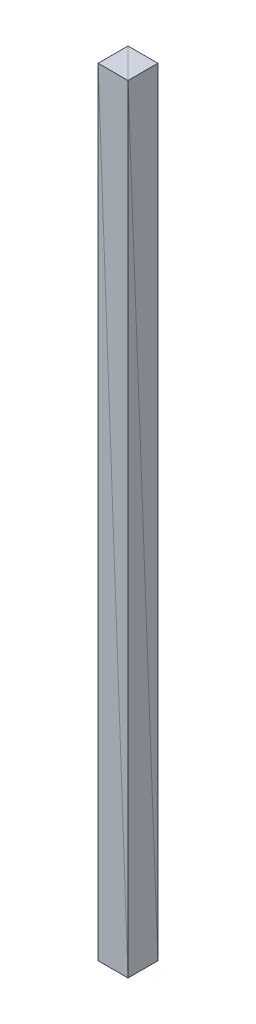
ISO-10303-21;
HEADER;
FILE_DESCRIPTION(('STEP AP214'),'2;1');
FILE_NAME('part.step','',(''),(''),'','','');
FILE_SCHEMA(('AUTOMOTIVE_DESIGN { 1 0 10303 214 1 1 1 1 }'));
ENDSEC;
DATA;
#1=APPLICATION_CONTEXT('core data for automotive mechanical design processes');
#2=APPLICATION_PROTOCOL_DEFINITION('international standard','automotive_design',2000,#1);
#3=PRODUCT_CONTEXT('',#1,'mechanical');
#4=PRODUCT('Part','Part','',(#3));
#5=PRODUCT_RELATED_PRODUCT_CATEGORY('part','',(#4));
#6=PRODUCT_DEFINITION_FORMATION('','',#4);
#7=PRODUCT_DEFINITION_CONTEXT('part definition',#1,'design');
#8=PRODUCT_DEFINITION('design','',#6,#7);
#9=PRODUCT_DEFINITION_SHAPE('','',#8);
#10=(LENGTH_UNIT() NAMED_UNIT(*) SI_UNIT(.MILLI.,.METRE.));
#11=(NAMED_UNIT(*) PLANE_ANGLE_UNIT() SI_UNIT($,.RADIAN.));
#12=(NAMED_UNIT(*) SI_UNIT($,.STERADIAN.) SOLID_ANGLE_UNIT());
#13=UNCERTAINTY_MEASURE_WITH_UNIT(LENGTH_MEASURE(1.E-05),#10,'distance_accuracy_value','');
#14=(GEOMETRIC_REPRESENTATION_CONTEXT(3) GLOBAL_UNCERTAINTY_ASSIGNED_CONTEXT((#13)) GLOBAL_UNIT_ASSIGNED_CONTEXT((#10,
#11,#12)) REPRESENTATION_CONTEXT('',''));
#15=CARTESIAN_POINT('',(0.,0.,0.));
#16=DIRECTION('',(0.,0.,1.));
#17=DIRECTION('',(1.,0.,0.));
#18=AXIS2_PLACEMENT_3D('',#15,#16,#17);
#19=CARTESIAN_POINT('',(0.,0.,0.));
#20=DIRECTION('',(0.,-1.,0.));
#21=DIRECTION('',(0.,0.,-1.));
#22=AXIS2_PLACEMENT_3D('',#19,#20,#21);
#23=PLANE('',#22);
#24=DIRECTION('',(0.,0.,1.));
#25=VECTOR('',#24,1.);
#26=CARTESIAN_POINT('',(0.,0.,0.));
#27=LINE('',#26,#25);
#28=CARTESIAN_POINT('',(0.,0.,0.));
#29=VERTEX_POINT('',#28);
#30=CARTESIAN_POINT('',(0.,0.,4.4999998062849));
#31=VERTEX_POINT('',#30);
#32=EDGE_CURVE('E19',#29,#31,#27,.T.);
#33=ORIENTED_EDGE('',*,*,#32,.F.);
#34=DIRECTION('',(-1.,0.,0.));
#35=VECTOR('',#34,1.);
#36=CARTESIAN_POINT('',(4.4999998062849,0.,0.));
#37=LINE('',#36,#35);
#38=CARTESIAN_POINT('',(4.4999998062849,0.,0.));
#39=VERTEX_POINT('',#38);
#40=EDGE_CURVE('E59',#39,#29,#37,.T.);
#41=ORIENTED_EDGE('',*,*,#40,.F.);
#42=DIRECTION('',(0.707106781186548,0.,-0.707106781186548));
#43=VECTOR('',#42,1.);
#44=CARTESIAN_POINT('',(0.,0.,4.4999998062849));
#45=LINE('',#44,#43);
#46=EDGE_CURVE('E75',#31,#39,#45,.T.);
#47=ORIENTED_EDGE('',*,*,#46,.F.);
#48=EDGE_LOOP('',(#33,#41,#47));
#49=FACE_BOUND('',#48,.T.);
#50=ADVANCED_FACE('F16',(#49),#23,.T.);
#51=CARTESIAN_POINT('',(0.,0.,0.));
#52=DIRECTION('',(1.,0.,0.));
#53=DIRECTION('',(0.,0.,-1.));
#54=AXIS2_PLACEMENT_3D('',#51,#52,#53);
#55=PLANE('',#54);
#56=ORIENTED_EDGE('',*,*,#32,.T.);
#57=DIRECTION('',(0.,-0.999261174678311,0.038433120879298));
#58=VECTOR('',#57,1.);
#59=CARTESIAN_POINT('',(0.,116.999998688698,0.));
#60=LINE('',#59,#58);
#61=CARTESIAN_POINT('',(0.,116.999998688698,0.));
#62=VERTEX_POINT('',#61);
#63=EDGE_CURVE('E86',#62,#31,#60,.T.);
#64=ORIENTED_EDGE('',*,*,#63,.F.);
#65=DIRECTION('',(0.,1.,0.));
#66=VECTOR('',#65,1.);
#67=CARTESIAN_POINT('',(0.,0.,0.));
#68=LINE('',#67,#66);
#69=EDGE_CURVE('E72',#29,#62,#68,.T.);
#70=ORIENTED_EDGE('',*,*,#69,.F.);
#71=EDGE_LOOP('',(#56,#64,#70));
#72=FACE_BOUND('',#71,.T.);
#73=ADVANCED_FACE('F149',(#72),#55,.F.);
#74=CARTESIAN_POINT('',(0.,0.,0.));
#75=DIRECTION('',(0.,0.,1.));
#76=DIRECTION('',(1.,0.,0.));
#77=AXIS2_PLACEMENT_3D('',#74,#75,#76);
#78=PLANE('',#77);
#79=ORIENTED_EDGE('',*,*,#40,.T.);
#80=DIRECTION('',(-0.038433120879298,-0.999261174678311,0.));
#81=VECTOR('',#80,1.);
#82=CARTESIAN_POINT('',(4.4999998062849,116.999998688698,0.));
#83=LINE('',#82,#81);
#84=CARTESIAN_POINT('',(4.4999998062849,116.999998688698,0.));
#85=VERTEX_POINT('',#84);
#86=EDGE_CURVE('E58',#85,#29,#83,.T.);
#87=ORIENTED_EDGE('',*,*,#86,.F.);
#88=DIRECTION('',(0.,1.,0.));
#89=VECTOR('',#88,1.);
#90=CARTESIAN_POINT('',(4.4999998062849,0.,0.));
#91=LINE('',#90,#89);
#92=EDGE_CURVE('E54',#39,#85,#91,.T.);
#93=ORIENTED_EDGE('',*,*,#92,.F.);
#94=EDGE_LOOP('',(#79,#87,#93));
#95=FACE_BOUND('',#94,.T.);
#96=ADVANCED_FACE('F60',(#95),#78,.F.);
#97=CARTESIAN_POINT('',(0.,0.,0.));
#98=DIRECTION('',(0.,0.,-1.));
#99=DIRECTION('',(-1.,0.,0.));
#100=AXIS2_PLACEMENT_3D('',#97,#98,#99);
#101=PLANE('',#100);
#102=ORIENTED_EDGE('',*,*,#69,.T.);
#103=DIRECTION('',(-1.,0.,0.));
#104=VECTOR('',#103,1.);
#105=CARTESIAN_POINT('',(4.4999998062849,116.999998688698,0.));
#106=LINE('',#105,#104);
#107=EDGE_CURVE('E81',#85,#62,#106,.T.);
#108=ORIENTED_EDGE('',*,*,#107,.F.);
#109=ORIENTED_EDGE('',*,*,#86,.T.);
#110=EDGE_LOOP('',(#102,#108,#109));
#111=FACE_BOUND('',#110,.T.);
#112=ADVANCED_FACE('F97',(#111),#101,.T.);
#113=CARTESIAN_POINT('',(0.,0.,0.));
#114=DIRECTION('',(0.,1.,0.));
#115=DIRECTION('',(0.,0.,1.));
#116=AXIS2_PLACEMENT_3D('',#113,#114,#115);
#117=PLANE('',#116);
#118=DIRECTION('',(1.,0.,0.));
#119=VECTOR('',#118,1.);
#120=CARTESIAN_POINT('',(0.,0.,4.4999998062849));
#121=LINE('',#120,#119);
#122=CARTESIAN_POINT('',(4.4999998062849,0.,4.4999998062849));
#123=VERTEX_POINT('',#122);
#124=EDGE_CURVE('E78',#31,#123,#121,.T.);
#125=ORIENTED_EDGE('',*,*,#124,.F.);
#126=ORIENTED_EDGE('',*,*,#46,.T.);
#127=DIRECTION('',(0.,0.,-1.));
#128=VECTOR('',#127,1.);
#129=CARTESIAN_POINT('',(4.4999998062849,0.,4.4999998062849));
#130=LINE('',#129,#128);
#131=EDGE_CURVE('E66',#123,#39,#130,.T.);
#132=ORIENTED_EDGE('',*,*,#131,.F.);
#133=EDGE_LOOP('',(#125,#126,#132));
#134=FACE_BOUND('',#133,.T.);
#135=ADVANCED_FACE('F80',(#134),#117,.F.);
#136=CARTESIAN_POINT('',(0.,116.999998688698,0.));
#137=DIRECTION('',(0.,1.,0.));
#138=DIRECTION('',(0.,0.,1.));
#139=AXIS2_PLACEMENT_3D('',#136,#137,#138);
#140=PLANE('',#139);
#141=DIRECTION('',(0.,0.,1.));
#142=VECTOR('',#141,1.);
#143=CARTESIAN_POINT('',(4.4999998062849,116.999998688698,0.));
#144=LINE('',#143,#142);
#145=CARTESIAN_POINT('',(4.4999998062849,116.999998688698,4.4999998062849));
#146=VERTEX_POINT('',#145);
#147=EDGE_CURVE('E65',#85,#146,#144,.T.);
#148=ORIENTED_EDGE('',*,*,#147,.F.);
#149=ORIENTED_EDGE('',*,*,#107,.T.);
#150=DIRECTION('',(-0.707106781186548,0.,-0.707106781186548));
#151=VECTOR('',#150,1.);
#152=CARTESIAN_POINT('',(4.4999998062849,116.999998688698,4.4999998062849));
#153=LINE('',#152,#151);
#154=EDGE_CURVE('E106',#146,#62,#153,.T.);
#155=ORIENTED_EDGE('',*,*,#154,.F.);
#156=EDGE_LOOP('',(#148,#149,#155));
#157=FACE_BOUND('',#156,.T.);
#158=ADVANCED_FACE('F102',(#157),#140,.T.);
#159=CARTESIAN_POINT('',(4.4999998062849,0.,0.));
#160=DIRECTION('',(-1.,0.,0.));
#161=DIRECTION('',(0.,0.,1.));
#162=AXIS2_PLACEMENT_3D('',#159,#160,#161);
#163=PLANE('',#162);
#164=ORIENTED_EDGE('',*,*,#131,.T.);
#165=DIRECTION('',(0.,-0.999261174678311,-0.038433120879298));
#166=VECTOR('',#165,1.);
#167=CARTESIAN_POINT('',(4.4999998062849,116.999998688698,4.4999998062849));
#168=LINE('',#167,#166);
#169=EDGE_CURVE('E82',#146,#39,#168,.T.);
#170=ORIENTED_EDGE('',*,*,#169,.F.);
#171=DIRECTION('',(0.,1.,0.));
#172=VECTOR('',#171,1.);
#173=CARTESIAN_POINT('',(4.4999998062849,0.,4.4999998062849));
#174=LINE('',#173,#172);
#175=EDGE_CURVE('E35',#123,#146,#174,.T.);
#176=ORIENTED_EDGE('',*,*,#175,.F.);
#177=EDGE_LOOP('',(#164,#170,#176));
#178=FACE_BOUND('',#177,.T.);
#179=ADVANCED_FACE('F83',(#178),#163,.F.);
#180=CARTESIAN_POINT('',(4.4999998062849,0.,0.));
#181=DIRECTION('',(1.,0.,0.));
#182=DIRECTION('',(0.,0.,-1.));
#183=AXIS2_PLACEMENT_3D('',#180,#181,#182);
#184=PLANE('',#183);
#185=ORIENTED_EDGE('',*,*,#92,.T.);
#186=ORIENTED_EDGE('',*,*,#147,.T.);
#187=ORIENTED_EDGE('',*,*,#169,.T.);
#188=EDGE_LOOP('',(#185,#186,#187));
#189=FACE_BOUND('',#188,.T.);
#190=ADVANCED_FACE('F87',(#189),#184,.T.);
#191=CARTESIAN_POINT('',(0.,0.,0.));
#192=DIRECTION('',(-1.,0.,0.));
#193=DIRECTION('',(0.,0.,1.));
#194=AXIS2_PLACEMENT_3D('',#191,#192,#193);
#195=PLANE('',#194);
#196=DIRECTION('',(0.,-1.,0.));
#197=VECTOR('',#196,1.);
#198=CARTESIAN_POINT('',(0.,116.999998688698,4.4999998062849));
#199=LINE('',#198,#197);
#200=CARTESIAN_POINT('',(0.,116.999998688698,4.4999998062849));
#201=VERTEX_POINT('',#200);
#202=EDGE_CURVE('E112',#201,#31,#199,.T.);
#203=ORIENTED_EDGE('',*,*,#202,.F.);
#204=DIRECTION('',(0.,0.,1.));
#205=VECTOR('',#204,1.);
#206=CARTESIAN_POINT('',(0.,116.999998688698,0.));
#207=LINE('',#206,#205);
#208=EDGE_CURVE('E89',#62,#201,#207,.T.);
#209=ORIENTED_EDGE('',*,*,#208,.F.);
#210=ORIENTED_EDGE('',*,*,#63,.T.);
#211=EDGE_LOOP('',(#203,#209,#210));
#212=FACE_BOUND('',#211,.T.);
#213=ADVANCED_FACE('F108',(#212),#195,.T.);
#214=CARTESIAN_POINT('',(0.,116.999998688698,0.));
#215=DIRECTION('',(0.,-1.,0.));
#216=DIRECTION('',(0.,0.,-1.));
#217=AXIS2_PLACEMENT_3D('',#214,#215,#216);
#218=PLANE('',#217);
#219=DIRECTION('',(-1.,0.,0.));
#220=VECTOR('',#219,1.);
#221=CARTESIAN_POINT('',(4.4999998062849,116.999998688698,4.4999998062849));
#222=LINE('',#221,#220);
#223=EDGE_CURVE('E25',#146,#201,#222,.T.);
#224=ORIENTED_EDGE('',*,*,#223,.F.);
#225=ORIENTED_EDGE('',*,*,#154,.T.);
#226=ORIENTED_EDGE('',*,*,#208,.T.);
#227=EDGE_LOOP('',(#224,#225,#226));
#228=FACE_BOUND('',#227,.T.);
#229=ADVANCED_FACE('F113',(#228),#218,.F.);
#230=CARTESIAN_POINT('',(0.,0.,4.4999998062849));
#231=DIRECTION('',(0.,0.,-1.));
#232=DIRECTION('',(-1.,0.,0.));
#233=AXIS2_PLACEMENT_3D('',#230,#231,#232);
#234=PLANE('',#233);
#235=ORIENTED_EDGE('',*,*,#124,.T.);
#236=DIRECTION('',(0.038433120879298,-0.999261174678311,0.));
#237=VECTOR('',#236,1.);
#238=CARTESIAN_POINT('',(0.,116.999998688698,4.4999998062849));
#239=LINE('',#238,#237);
#240=EDGE_CURVE('E10',#201,#123,#239,.T.);
#241=ORIENTED_EDGE('',*,*,#240,.F.);
#242=ORIENTED_EDGE('',*,*,#202,.T.);
#243=EDGE_LOOP('',(#235,#241,#242));
#244=FACE_BOUND('',#243,.T.);
#245=ADVANCED_FACE('F124',(#244),#234,.F.);
#246=CARTESIAN_POINT('',(0.,0.,4.4999998062849));
#247=DIRECTION('',(0.,0.,1.));
#248=DIRECTION('',(1.,0.,0.));
#249=AXIS2_PLACEMENT_3D('',#246,#247,#248);
#250=PLANE('',#249);
#251=ORIENTED_EDGE('',*,*,#175,.T.);
#252=ORIENTED_EDGE('',*,*,#223,.T.);
#253=ORIENTED_EDGE('',*,*,#240,.T.);
#254=EDGE_LOOP('',(#251,#252,#253));
#255=FACE_BOUND('',#254,.T.);
#256=ADVANCED_FACE('F123',(#255),#250,.T.);
#257=CLOSED_SHELL('',(#50,#73,#96,#112,#135,#158,#179,#190,#213,#229,#245,#256));
#258=MANIFOLD_SOLID_BREP('B1',#257);
#259=ADVANCED_BREP_SHAPE_REPRESENTATION('',(#18,#258),#14);
#260=SHAPE_DEFINITION_REPRESENTATION(#9,#259);
ENDSEC;
END-ISO-10303-21;
